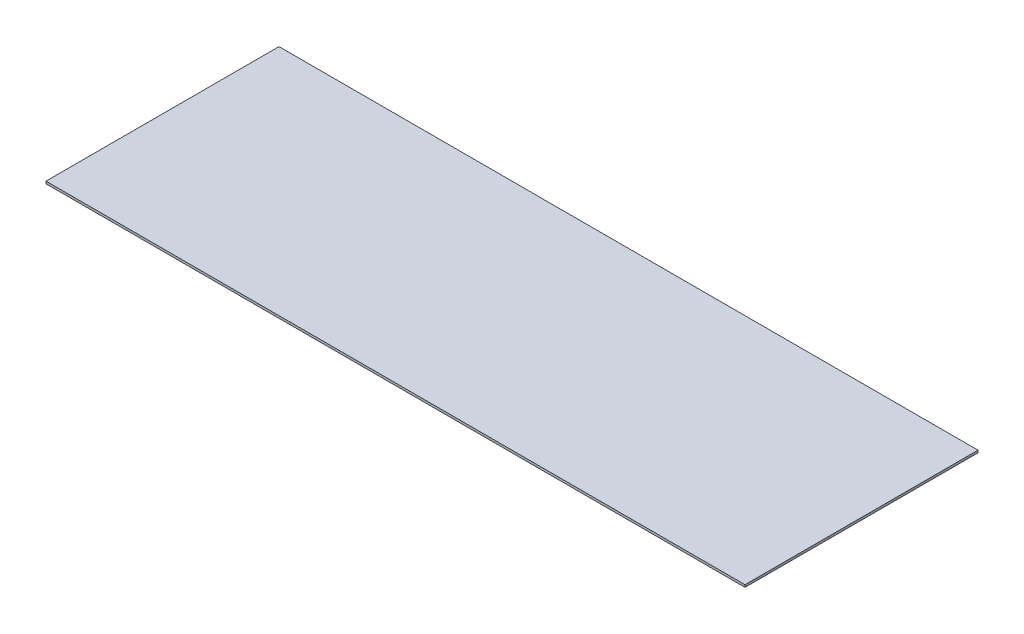
ISO-10303-21;
HEADER;
FILE_DESCRIPTION(('STEP AP214'),'2;1');
FILE_NAME('part.step','',(''),(''),'','','');
FILE_SCHEMA(('AUTOMOTIVE_DESIGN { 1 0 10303 214 1 1 1 1 }'));
ENDSEC;
DATA;
#1=APPLICATION_CONTEXT('core data for automotive mechanical design processes');
#2=APPLICATION_PROTOCOL_DEFINITION('international standard','automotive_design',2000,#1);
#3=PRODUCT_CONTEXT('',#1,'mechanical');
#4=PRODUCT('Part','Part','',(#3));
#5=PRODUCT_RELATED_PRODUCT_CATEGORY('part','',(#4));
#6=PRODUCT_DEFINITION_FORMATION('','',#4);
#7=PRODUCT_DEFINITION_CONTEXT('part definition',#1,'design');
#8=PRODUCT_DEFINITION('design','',#6,#7);
#9=PRODUCT_DEFINITION_SHAPE('','',#8);
#10=(LENGTH_UNIT() NAMED_UNIT(*) SI_UNIT(.MILLI.,.METRE.));
#11=(NAMED_UNIT(*) PLANE_ANGLE_UNIT() SI_UNIT($,.RADIAN.));
#12=(NAMED_UNIT(*) SI_UNIT($,.STERADIAN.) SOLID_ANGLE_UNIT());
#13=UNCERTAINTY_MEASURE_WITH_UNIT(LENGTH_MEASURE(1.E-05),#10,'distance_accuracy_value','');
#14=(GEOMETRIC_REPRESENTATION_CONTEXT(3) GLOBAL_UNCERTAINTY_ASSIGNED_CONTEXT((#13)) GLOBAL_UNIT_ASSIGNED_CONTEXT((#10,
#11,#12)) REPRESENTATION_CONTEXT('',''));
#15=CARTESIAN_POINT('',(0.,0.,0.));
#16=DIRECTION('',(0.,0.,1.));
#17=DIRECTION('',(1.,0.,0.));
#18=AXIS2_PLACEMENT_3D('',#15,#16,#17);
#19=CARTESIAN_POINT('',(150.,1.,-50.));
#20=DIRECTION('',(-1.,0.,0.));
#21=DIRECTION('',(0.,0.,1.));
#22=AXIS2_PLACEMENT_3D('',#19,#20,#21);
#23=PLANE('',#22);
#24=DIRECTION('',(0.,0.,-1.));
#25=VECTOR('',#24,1.);
#26=CARTESIAN_POINT('',(150.,0.,-50.));
#27=LINE('',#26,#25);
#28=CARTESIAN_POINT('',(150.,0.,50.));
#29=VERTEX_POINT('',#28);
#30=CARTESIAN_POINT('',(150.,0.,-50.));
#31=VERTEX_POINT('',#30);
#32=EDGE_CURVE('E99',#29,#31,#27,.T.);
#33=ORIENTED_EDGE('',*,*,#32,.T.);
#34=DIRECTION('',(0.,-1.,0.));
#35=VECTOR('',#34,1.);
#36=CARTESIAN_POINT('',(150.,1.,-50.));
#37=LINE('',#36,#35);
#38=CARTESIAN_POINT('',(150.,1.,-50.));
#39=VERTEX_POINT('',#38);
#40=EDGE_CURVE('E11',#39,#31,#37,.T.);
#41=ORIENTED_EDGE('',*,*,#40,.F.);
#42=DIRECTION('',(0.,0.,-1.));
#43=VECTOR('',#42,1.);
#44=CARTESIAN_POINT('',(150.,1.,-50.));
#45=LINE('',#44,#43);
#46=CARTESIAN_POINT('',(150.,1.,50.));
#47=VERTEX_POINT('',#46);
#48=EDGE_CURVE('E87',#47,#39,#45,.T.);
#49=ORIENTED_EDGE('',*,*,#48,.F.);
#50=DIRECTION('',(0.,-1.,0.));
#51=VECTOR('',#50,1.);
#52=CARTESIAN_POINT('',(150.,1.,50.));
#53=LINE('',#52,#51);
#54=EDGE_CURVE('E95',#47,#29,#53,.T.);
#55=ORIENTED_EDGE('',*,*,#54,.T.);
#56=EDGE_LOOP('',(#33,#41,#49,#55));
#57=FACE_BOUND('',#56,.T.);
#58=ADVANCED_FACE('F36',(#57),#23,.F.);
#59=CARTESIAN_POINT('',(-150.,1.,-50.));
#60=DIRECTION('',(0.,0.,1.));
#61=DIRECTION('',(1.,0.,0.));
#62=AXIS2_PLACEMENT_3D('',#59,#60,#61);
#63=PLANE('',#62);
#64=DIRECTION('',(-1.,0.,0.));
#65=VECTOR('',#64,1.);
#66=CARTESIAN_POINT('',(-150.,0.,-50.));
#67=LINE('',#66,#65);
#68=CARTESIAN_POINT('',(-150.,0.,-50.));
#69=VERTEX_POINT('',#68);
#70=EDGE_CURVE('E91',#31,#69,#67,.T.);
#71=ORIENTED_EDGE('',*,*,#70,.T.);
#72=DIRECTION('',(0.,-1.,0.));
#73=VECTOR('',#72,1.);
#74=CARTESIAN_POINT('',(-150.,1.,-50.));
#75=LINE('',#74,#73);
#76=CARTESIAN_POINT('',(-150.,1.,-50.));
#77=VERTEX_POINT('',#76);
#78=EDGE_CURVE('E44',#77,#69,#75,.T.);
#79=ORIENTED_EDGE('',*,*,#78,.F.);
#80=DIRECTION('',(-1.,0.,0.));
#81=VECTOR('',#80,1.);
#82=CARTESIAN_POINT('',(-150.,1.,-50.));
#83=LINE('',#82,#81);
#84=EDGE_CURVE('E82',#39,#77,#83,.T.);
#85=ORIENTED_EDGE('',*,*,#84,.F.);
#86=ORIENTED_EDGE('',*,*,#40,.T.);
#87=EDGE_LOOP('',(#71,#79,#85,#86));
#88=FACE_BOUND('',#87,.T.);
#89=ADVANCED_FACE('F90',(#88),#63,.F.);
#90=CARTESIAN_POINT('',(-150.,1.,-50.));
#91=DIRECTION('',(1.,0.,0.));
#92=DIRECTION('',(0.,0.,-1.));
#93=AXIS2_PLACEMENT_3D('',#90,#91,#92);
#94=PLANE('',#93);
#95=DIRECTION('',(0.,0.,1.));
#96=VECTOR('',#95,1.);
#97=CARTESIAN_POINT('',(-150.,0.,-50.));
#98=LINE('',#97,#96);
#99=CARTESIAN_POINT('',(-150.,0.,50.));
#100=VERTEX_POINT('',#99);
#101=EDGE_CURVE('E69',#69,#100,#98,.T.);
#102=ORIENTED_EDGE('',*,*,#101,.T.);
#103=DIRECTION('',(0.,-1.,0.));
#104=VECTOR('',#103,1.);
#105=CARTESIAN_POINT('',(-150.,1.,50.));
#106=LINE('',#105,#104);
#107=CARTESIAN_POINT('',(-150.,1.,50.));
#108=VERTEX_POINT('',#107);
#109=EDGE_CURVE('E92',#108,#100,#106,.T.);
#110=ORIENTED_EDGE('',*,*,#109,.F.);
#111=DIRECTION('',(0.,0.,1.));
#112=VECTOR('',#111,1.);
#113=CARTESIAN_POINT('',(-150.,1.,-50.));
#114=LINE('',#113,#112);
#115=EDGE_CURVE('E85',#77,#108,#114,.T.);
#116=ORIENTED_EDGE('',*,*,#115,.F.);
#117=ORIENTED_EDGE('',*,*,#78,.T.);
#118=EDGE_LOOP('',(#102,#110,#116,#117));
#119=FACE_BOUND('',#118,.T.);
#120=ADVANCED_FACE('F93',(#119),#94,.F.);
#121=CARTESIAN_POINT('',(-150.,1.,50.));
#122=DIRECTION('',(0.,0.,-1.));
#123=DIRECTION('',(-1.,0.,0.));
#124=AXIS2_PLACEMENT_3D('',#121,#122,#123);
#125=PLANE('',#124);
#126=DIRECTION('',(1.,0.,0.));
#127=VECTOR('',#126,1.);
#128=CARTESIAN_POINT('',(-150.,0.,50.));
#129=LINE('',#128,#127);
#130=EDGE_CURVE('E75',#100,#29,#129,.T.);
#131=ORIENTED_EDGE('',*,*,#130,.T.);
#132=ORIENTED_EDGE('',*,*,#54,.F.);
#133=DIRECTION('',(1.,0.,0.));
#134=VECTOR('',#133,1.);
#135=CARTESIAN_POINT('',(-150.,1.,50.));
#136=LINE('',#135,#134);
#137=EDGE_CURVE('E52',#108,#47,#136,.T.);
#138=ORIENTED_EDGE('',*,*,#137,.F.);
#139=ORIENTED_EDGE('',*,*,#109,.T.);
#140=EDGE_LOOP('',(#131,#132,#138,#139));
#141=FACE_BOUND('',#140,.T.);
#142=ADVANCED_FACE('F106',(#141),#125,.F.);
#143=CARTESIAN_POINT('',(0.,1.,0.));
#144=DIRECTION('',(0.,1.,0.));
#145=DIRECTION('',(0.,0.,1.));
#146=AXIS2_PLACEMENT_3D('',#143,#144,#145);
#147=PLANE('',#146);
#148=ORIENTED_EDGE('',*,*,#48,.T.);
#149=ORIENTED_EDGE('',*,*,#84,.T.);
#150=ORIENTED_EDGE('',*,*,#115,.T.);
#151=ORIENTED_EDGE('',*,*,#137,.T.);
#152=EDGE_LOOP('',(#148,#149,#150,#151));
#153=FACE_BOUND('',#152,.T.);
#154=ADVANCED_FACE('F83',(#153),#147,.T.);
#155=CARTESIAN_POINT('',(0.,0.,0.));
#156=DIRECTION('',(0.,1.,0.));
#157=DIRECTION('',(0.,0.,1.));
#158=AXIS2_PLACEMENT_3D('',#155,#156,#157);
#159=PLANE('',#158);
#160=ORIENTED_EDGE('',*,*,#32,.F.);
#161=ORIENTED_EDGE('',*,*,#130,.F.);
#162=ORIENTED_EDGE('',*,*,#101,.F.);
#163=ORIENTED_EDGE('',*,*,#70,.F.);
#164=EDGE_LOOP('',(#160,#161,#162,#163));
#165=FACE_BOUND('',#164,.T.);
#166=ADVANCED_FACE('F109',(#165),#159,.F.);
#167=CLOSED_SHELL('',(#58,#89,#120,#142,#154,#166));
#168=MANIFOLD_SOLID_BREP('B2',#167);
#169=ADVANCED_BREP_SHAPE_REPRESENTATION('',(#18,#168),#14);
#170=SHAPE_DEFINITION_REPRESENTATION(#9,#169);
ENDSEC;
END-ISO-10303-21;
